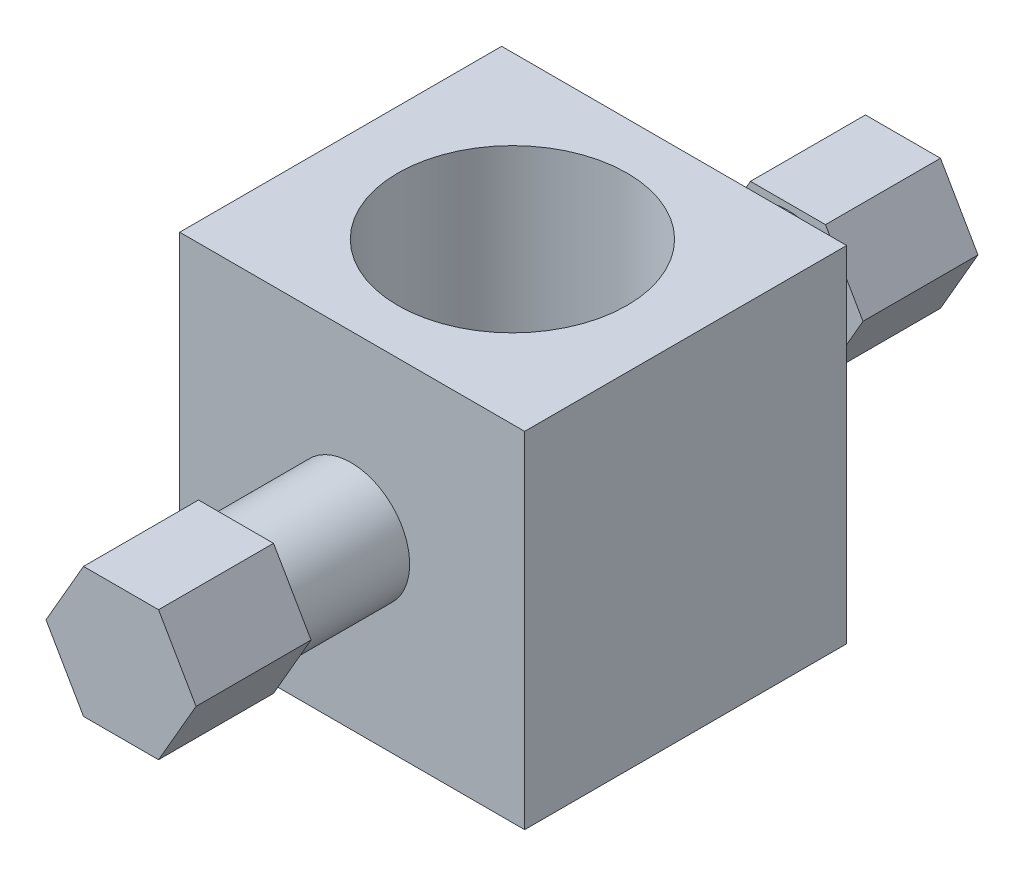
ISO-10303-21;
HEADER;
FILE_DESCRIPTION(('STEP AP214'),'2;1');
FILE_NAME('part.step','',(''),(''),'','','');
FILE_SCHEMA(('AUTOMOTIVE_DESIGN { 1 0 10303 214 1 1 1 1 }'));
ENDSEC;
DATA;
#1=APPLICATION_CONTEXT('core data for automotive mechanical design processes');
#2=APPLICATION_PROTOCOL_DEFINITION('international standard','automotive_design',2000,#1);
#3=PRODUCT_CONTEXT('',#1,'mechanical');
#4=PRODUCT('Part','Part','',(#3));
#5=PRODUCT_RELATED_PRODUCT_CATEGORY('part','',(#4));
#6=PRODUCT_DEFINITION_FORMATION('','',#4);
#7=PRODUCT_DEFINITION_CONTEXT('part definition',#1,'design');
#8=PRODUCT_DEFINITION('design','',#6,#7);
#9=PRODUCT_DEFINITION_SHAPE('','',#8);
#10=(LENGTH_UNIT() NAMED_UNIT(*) SI_UNIT(.MILLI.,.METRE.));
#11=(NAMED_UNIT(*) PLANE_ANGLE_UNIT() SI_UNIT($,.RADIAN.));
#12=(NAMED_UNIT(*) SI_UNIT($,.STERADIAN.) SOLID_ANGLE_UNIT());
#13=UNCERTAINTY_MEASURE_WITH_UNIT(LENGTH_MEASURE(1.E-05),#10,'distance_accuracy_value','');
#14=(GEOMETRIC_REPRESENTATION_CONTEXT(3) GLOBAL_UNCERTAINTY_ASSIGNED_CONTEXT((#13)) GLOBAL_UNIT_ASSIGNED_CONTEXT((#10,
#11,#12)) REPRESENTATION_CONTEXT('',''));
#15=CARTESIAN_POINT('',(0.,0.,0.));
#16=DIRECTION('',(0.,0.,1.));
#17=DIRECTION('',(1.,0.,0.));
#18=AXIS2_PLACEMENT_3D('',#15,#16,#17);
#19=CARTESIAN_POINT('',(0.,0.,24.));
#20=DIRECTION('',(0.,0.,-1.));
#21=DIRECTION('',(-1.,0.,0.));
#22=AXIS2_PLACEMENT_3D('',#19,#20,#21);
#23=CYLINDRICAL_SURFACE('',#22,2.55);
#24=CARTESIAN_POINT('',(0.,0.,24.));
#25=DIRECTION('',(0.,0.,1.));
#26=DIRECTION('',(1.,0.,0.));
#27=AXIS2_PLACEMENT_3D('',#24,#25,#26);
#28=CIRCLE('',#27,2.55);
#29=CARTESIAN_POINT('',(2.55,0.,24.));
#30=VERTEX_POINT('',#29);
#31=EDGE_CURVE('E165',#30,#30,#28,.T.);
#32=ORIENTED_EDGE('',*,*,#31,.F.);
#33=EDGE_LOOP('',(#32));
#34=FACE_BOUND('',#33,.T.);
#35=CARTESIAN_POINT('',(0.,0.,19.));
#36=DIRECTION('',(0.,0.,-1.));
#37=DIRECTION('',(-1.,0.,0.));
#38=AXIS2_PLACEMENT_3D('',#35,#36,#37);
#39=CIRCLE('',#38,2.55);
#40=CARTESIAN_POINT('',(-2.55,0.,19.));
#41=VERTEX_POINT('',#40);
#42=EDGE_CURVE('E11',#41,#41,#39,.T.);
#43=ORIENTED_EDGE('',*,*,#42,.F.);
#44=EDGE_LOOP('',(#43));
#45=FACE_BOUND('',#44,.T.);
#46=ADVANCED_FACE('F39',(#34,#45),#23,.T.);
#47=CARTESIAN_POINT('',(1.6310942277798,-2.82513807444687,29.));
#48=DIRECTION('',(-0.866025403784442,0.499999999999995,0.));
#49=DIRECTION('',(-0.499999999999995,-0.866025403784442,0.));
#50=AXIS2_PLACEMENT_3D('',#47,#48,#49);
#51=PLANE('',#50);
#52=DIRECTION('',(0.499999999999995,0.866025403784442,0.));
#53=VECTOR('',#52,1.);
#54=CARTESIAN_POINT('',(1.6310942277798,-2.82513807444687,24.));
#55=LINE('',#54,#53);
#56=CARTESIAN_POINT('',(1.6310942277798,-2.82513807444687,24.));
#57=VERTEX_POINT('',#56);
#58=CARTESIAN_POINT('',(3.26218845555954,0.,24.));
#59=VERTEX_POINT('',#58);
#60=EDGE_CURVE('E134',#57,#59,#55,.T.);
#61=ORIENTED_EDGE('',*,*,#60,.T.);
#62=DIRECTION('',(0.,0.,-1.));
#63=VECTOR('',#62,1.);
#64=CARTESIAN_POINT('',(3.26218845555954,0.,29.));
#65=LINE('',#64,#63);
#66=CARTESIAN_POINT('',(3.26218845555954,0.,29.));
#67=VERTEX_POINT('',#66);
#68=EDGE_CURVE('E162',#67,#59,#65,.T.);
#69=ORIENTED_EDGE('',*,*,#68,.F.);
#70=DIRECTION('',(0.499999999999995,0.866025403784442,0.));
#71=VECTOR('',#70,1.);
#72=CARTESIAN_POINT('',(1.6310942277798,-2.82513807444687,29.));
#73=LINE('',#72,#71);
#74=CARTESIAN_POINT('',(1.6310942277798,-2.82513807444687,29.));
#75=VERTEX_POINT('',#74);
#76=EDGE_CURVE('E151',#75,#67,#73,.T.);
#77=ORIENTED_EDGE('',*,*,#76,.F.);
#78=DIRECTION('',(0.,0.,-1.));
#79=VECTOR('',#78,1.);
#80=CARTESIAN_POINT('',(1.6310942277798,-2.82513807444687,29.));
#81=LINE('',#80,#79);
#82=EDGE_CURVE('E130',#75,#57,#81,.T.);
#83=ORIENTED_EDGE('',*,*,#82,.T.);
#84=EDGE_LOOP('',(#61,#69,#77,#83));
#85=FACE_BOUND('',#84,.T.);
#86=ADVANCED_FACE('F195',(#85),#51,.F.);
#87=CARTESIAN_POINT('',(3.26218845555954,0.,29.));
#88=DIRECTION('',(-0.866025403784438,-0.500000000000001,0.));
#89=DIRECTION('',(0.500000000000001,-0.866025403784438,0.));
#90=AXIS2_PLACEMENT_3D('',#87,#88,#89);
#91=PLANE('',#90);
#92=DIRECTION('',(-0.500000000000001,0.866025403784438,0.));
#93=VECTOR('',#92,1.);
#94=CARTESIAN_POINT('',(3.26218845555954,0.,24.));
#95=LINE('',#94,#93);
#96=CARTESIAN_POINT('',(1.63109422777977,2.82513807444689,24.));
#97=VERTEX_POINT('',#96);
#98=EDGE_CURVE('E138',#59,#97,#95,.T.);
#99=ORIENTED_EDGE('',*,*,#98,.T.);
#100=DIRECTION('',(0.,0.,-1.));
#101=VECTOR('',#100,1.);
#102=CARTESIAN_POINT('',(1.63109422777977,2.82513807444689,29.));
#103=LINE('',#102,#101);
#104=CARTESIAN_POINT('',(1.63109422777977,2.82513807444689,29.));
#105=VERTEX_POINT('',#104);
#106=EDGE_CURVE('E158',#105,#97,#103,.T.);
#107=ORIENTED_EDGE('',*,*,#106,.F.);
#108=DIRECTION('',(-0.500000000000001,0.866025403784438,0.));
#109=VECTOR('',#108,1.);
#110=CARTESIAN_POINT('',(3.26218845555954,0.,29.));
#111=LINE('',#110,#109);
#112=EDGE_CURVE('E96',#67,#105,#111,.T.);
#113=ORIENTED_EDGE('',*,*,#112,.F.);
#114=ORIENTED_EDGE('',*,*,#68,.T.);
#115=EDGE_LOOP('',(#99,#107,#113,#114));
#116=FACE_BOUND('',#115,.T.);
#117=ADVANCED_FACE('F200',(#116),#91,.F.);
#118=CARTESIAN_POINT('',(1.63109422777977,2.82513807444689,29.));
#119=DIRECTION('',(0.,-1.,0.));
#120=DIRECTION('',(1.,0.,0.));
#121=AXIS2_PLACEMENT_3D('',#118,#119,#120);
#122=PLANE('',#121);
#123=DIRECTION('',(-1.,0.,0.));
#124=VECTOR('',#123,1.);
#125=CARTESIAN_POINT('',(1.63109422777977,2.82513807444689,24.));
#126=LINE('',#125,#124);
#127=CARTESIAN_POINT('',(-1.63109422777978,2.82513807444688,24.));
#128=VERTEX_POINT('',#127);
#129=EDGE_CURVE('E142',#97,#128,#126,.T.);
#130=ORIENTED_EDGE('',*,*,#129,.T.);
#131=DIRECTION('',(0.,0.,-1.));
#132=VECTOR('',#131,1.);
#133=CARTESIAN_POINT('',(-1.63109422777978,2.82513807444688,29.));
#134=LINE('',#133,#132);
#135=CARTESIAN_POINT('',(-1.63109422777978,2.82513807444688,29.));
#136=VERTEX_POINT('',#135);
#137=EDGE_CURVE('E123',#136,#128,#134,.T.);
#138=ORIENTED_EDGE('',*,*,#137,.F.);
#139=DIRECTION('',(-1.,0.,0.));
#140=VECTOR('',#139,1.);
#141=CARTESIAN_POINT('',(1.63109422777977,2.82513807444689,29.));
#142=LINE('',#141,#140);
#143=EDGE_CURVE('E112',#105,#136,#142,.T.);
#144=ORIENTED_EDGE('',*,*,#143,.F.);
#145=ORIENTED_EDGE('',*,*,#106,.T.);
#146=EDGE_LOOP('',(#130,#138,#144,#145));
#147=FACE_BOUND('',#146,.T.);
#148=ADVANCED_FACE('F361',(#147),#122,.F.);
#149=CARTESIAN_POINT('',(-1.63109422777978,2.82513807444688,29.));
#150=DIRECTION('',(0.866025403784442,-0.499999999999995,0.));
#151=DIRECTION('',(0.499999999999995,0.866025403784442,0.));
#152=AXIS2_PLACEMENT_3D('',#149,#150,#151);
#153=PLANE('',#152);
#154=DIRECTION('',(-0.499999999999995,-0.866025403784442,0.));
#155=VECTOR('',#154,1.);
#156=CARTESIAN_POINT('',(-1.63109422777978,2.82513807444688,24.));
#157=LINE('',#156,#155);
#158=CARTESIAN_POINT('',(-3.26218845555954,0.,24.));
#159=VERTEX_POINT('',#158);
#160=EDGE_CURVE('E121',#128,#159,#157,.T.);
#161=ORIENTED_EDGE('',*,*,#160,.T.);
#162=DIRECTION('',(0.,0.,-1.));
#163=VECTOR('',#162,1.);
#164=CARTESIAN_POINT('',(-3.26218845555954,0.,29.));
#165=LINE('',#164,#163);
#166=CARTESIAN_POINT('',(-3.26218845555954,0.,29.));
#167=VERTEX_POINT('',#166);
#168=EDGE_CURVE('E118',#167,#159,#165,.T.);
#169=ORIENTED_EDGE('',*,*,#168,.F.);
#170=DIRECTION('',(-0.499999999999995,-0.866025403784442,0.));
#171=VECTOR('',#170,1.);
#172=CARTESIAN_POINT('',(-1.63109422777978,2.82513807444688,29.));
#173=LINE('',#172,#171);
#174=EDGE_CURVE('E106',#136,#167,#173,.T.);
#175=ORIENTED_EDGE('',*,*,#174,.F.);
#176=ORIENTED_EDGE('',*,*,#137,.T.);
#177=EDGE_LOOP('',(#161,#169,#175,#176));
#178=FACE_BOUND('',#177,.T.);
#179=ADVANCED_FACE('F119',(#178),#153,.F.);
#180=CARTESIAN_POINT('',(-3.26218845555954,0.,29.));
#181=DIRECTION('',(0.866025403784435,0.500000000000007,0.));
#182=DIRECTION('',(-0.500000000000007,0.866025403784435,0.));
#183=AXIS2_PLACEMENT_3D('',#180,#181,#182);
#184=PLANE('',#183);
#185=DIRECTION('',(0.500000000000007,-0.866025403784435,0.));
#186=VECTOR('',#185,1.);
#187=CARTESIAN_POINT('',(-3.26218845555954,0.,24.));
#188=LINE('',#187,#186);
#189=CARTESIAN_POINT('',(-1.63109422777975,-2.8251380744469,24.));
#190=VERTEX_POINT('',#189);
#191=EDGE_CURVE('E81',#159,#190,#188,.T.);
#192=ORIENTED_EDGE('',*,*,#191,.T.);
#193=DIRECTION('',(0.,0.,-1.));
#194=VECTOR('',#193,1.);
#195=CARTESIAN_POINT('',(-1.63109422777975,-2.8251380744469,29.));
#196=LINE('',#195,#194);
#197=CARTESIAN_POINT('',(-1.63109422777975,-2.8251380744469,29.));
#198=VERTEX_POINT('',#197);
#199=EDGE_CURVE('E124',#198,#190,#196,.T.);
#200=ORIENTED_EDGE('',*,*,#199,.F.);
#201=DIRECTION('',(0.500000000000007,-0.866025403784435,0.));
#202=VECTOR('',#201,1.);
#203=CARTESIAN_POINT('',(-3.26218845555954,0.,29.));
#204=LINE('',#203,#202);
#205=EDGE_CURVE('E110',#167,#198,#204,.T.);
#206=ORIENTED_EDGE('',*,*,#205,.F.);
#207=ORIENTED_EDGE('',*,*,#168,.T.);
#208=EDGE_LOOP('',(#192,#200,#206,#207));
#209=FACE_BOUND('',#208,.T.);
#210=ADVANCED_FACE('F126',(#209),#184,.F.);
#211=CARTESIAN_POINT('',(-1.63109422777975,-2.8251380744469,29.));
#212=DIRECTION('',(0.,1.,0.));
#213=DIRECTION('',(-1.,0.,0.));
#214=AXIS2_PLACEMENT_3D('',#211,#212,#213);
#215=PLANE('',#214);
#216=DIRECTION('',(1.,0.,0.));
#217=VECTOR('',#216,1.);
#218=CARTESIAN_POINT('',(-1.63109422777975,-2.8251380744469,24.));
#219=LINE('',#218,#217);
#220=EDGE_CURVE('E87',#190,#57,#219,.T.);
#221=ORIENTED_EDGE('',*,*,#220,.T.);
#222=ORIENTED_EDGE('',*,*,#82,.F.);
#223=DIRECTION('',(1.,0.,0.));
#224=VECTOR('',#223,1.);
#225=CARTESIAN_POINT('',(-1.63109422777975,-2.8251380744469,29.));
#226=LINE('',#225,#224);
#227=EDGE_CURVE('E57',#198,#75,#226,.T.);
#228=ORIENTED_EDGE('',*,*,#227,.F.);
#229=ORIENTED_EDGE('',*,*,#199,.T.);
#230=EDGE_LOOP('',(#221,#222,#228,#229));
#231=FACE_BOUND('',#230,.T.);
#232=ADVANCED_FACE('F365',(#231),#215,.F.);
#233=CARTESIAN_POINT('',(0.,0.,29.));
#234=DIRECTION('',(0.,0.,1.));
#235=DIRECTION('',(1.,0.,0.));
#236=AXIS2_PLACEMENT_3D('',#233,#234,#235);
#237=PLANE('',#236);
#238=ORIENTED_EDGE('',*,*,#76,.T.);
#239=ORIENTED_EDGE('',*,*,#112,.T.);
#240=ORIENTED_EDGE('',*,*,#143,.T.);
#241=ORIENTED_EDGE('',*,*,#174,.T.);
#242=ORIENTED_EDGE('',*,*,#205,.T.);
#243=ORIENTED_EDGE('',*,*,#227,.T.);
#244=EDGE_LOOP('',(#238,#239,#240,#241,#242,#243));
#245=FACE_BOUND('',#244,.T.);
#246=ADVANCED_FACE('F108',(#245),#237,.T.);
#247=CARTESIAN_POINT('',(0.,0.,24.));
#248=DIRECTION('',(0.,0.,1.));
#249=DIRECTION('',(1.,0.,0.));
#250=AXIS2_PLACEMENT_3D('',#247,#248,#249);
#251=PLANE('',#250);
#252=ORIENTED_EDGE('',*,*,#31,.T.);
#253=EDGE_LOOP('',(#252));
#254=FACE_BOUND('',#253,.T.);
#255=ORIENTED_EDGE('',*,*,#60,.F.);
#256=ORIENTED_EDGE('',*,*,#220,.F.);
#257=ORIENTED_EDGE('',*,*,#191,.F.);
#258=ORIENTED_EDGE('',*,*,#160,.F.);
#259=ORIENTED_EDGE('',*,*,#129,.F.);
#260=ORIENTED_EDGE('',*,*,#98,.F.);
#261=EDGE_LOOP('',(#255,#256,#257,#258,#259,#260));
#262=FACE_BOUND('',#261,.T.);
#263=ADVANCED_FACE('F364',(#254,#262),#251,.F.);
#264=CARTESIAN_POINT('',(-7.45,7.5,5.));
#265=DIRECTION('',(1.,0.,0.));
#266=DIRECTION('',(0.,0.,-1.));
#267=AXIS2_PLACEMENT_3D('',#264,#265,#266);
#268=PLANE('',#267);
#269=DIRECTION('',(0.,-1.,0.));
#270=VECTOR('',#269,1.);
#271=CARTESIAN_POINT('',(-7.45,7.5,5.));
#272=LINE('',#271,#270);
#273=CARTESIAN_POINT('',(-7.45,7.5,5.));
#274=VERTEX_POINT('',#273);
#275=CARTESIAN_POINT('',(-7.45,-7.5,5.));
#276=VERTEX_POINT('',#275);
#277=EDGE_CURVE('E248',#274,#276,#272,.T.);
#278=ORIENTED_EDGE('',*,*,#277,.T.);
#279=DIRECTION('',(0.,0.,1.));
#280=VECTOR('',#279,1.);
#281=CARTESIAN_POINT('',(-7.45,-7.5,5.));
#282=LINE('',#281,#280);
#283=CARTESIAN_POINT('',(-7.45,-7.5,19.));
#284=VERTEX_POINT('',#283);
#285=EDGE_CURVE('E240',#276,#284,#282,.T.);
#286=ORIENTED_EDGE('',*,*,#285,.T.);
#287=DIRECTION('',(0.,-1.,0.));
#288=VECTOR('',#287,1.);
#289=CARTESIAN_POINT('',(-7.45,7.5,19.));
#290=LINE('',#289,#288);
#291=CARTESIAN_POINT('',(-7.45,7.5,19.));
#292=VERTEX_POINT('',#291);
#293=EDGE_CURVE('E217',#292,#284,#290,.T.);
#294=ORIENTED_EDGE('',*,*,#293,.F.);
#295=DIRECTION('',(0.,0.,1.));
#296=VECTOR('',#295,1.);
#297=CARTESIAN_POINT('',(-7.45,7.5,5.));
#298=LINE('',#297,#296);
#299=EDGE_CURVE('E261',#274,#292,#298,.T.);
#300=ORIENTED_EDGE('',*,*,#299,.F.);
#301=EDGE_LOOP('',(#278,#286,#294,#300));
#302=FACE_BOUND('',#301,.T.);
#303=ADVANCED_FACE('F210',(#302),#268,.F.);
#304=CARTESIAN_POINT('',(-7.45,7.5,19.));
#305=DIRECTION('',(0.,0.,-1.));
#306=DIRECTION('',(-1.,0.,0.));
#307=AXIS2_PLACEMENT_3D('',#304,#305,#306);
#308=PLANE('',#307);
#309=ORIENTED_EDGE('',*,*,#42,.T.);
#310=EDGE_LOOP('',(#309));
#311=FACE_BOUND('',#310,.T.);
#312=ORIENTED_EDGE('',*,*,#293,.T.);
#313=DIRECTION('',(1.,0.,0.));
#314=VECTOR('',#313,1.);
#315=CARTESIAN_POINT('',(-7.45,-7.5,19.));
#316=LINE('',#315,#314);
#317=CARTESIAN_POINT('',(7.55,-7.5,19.));
#318=VERTEX_POINT('',#317);
#319=EDGE_CURVE('E221',#284,#318,#316,.T.);
#320=ORIENTED_EDGE('',*,*,#319,.T.);
#321=DIRECTION('',(0.,-1.,0.));
#322=VECTOR('',#321,1.);
#323=CARTESIAN_POINT('',(7.55,7.5,19.));
#324=LINE('',#323,#322);
#325=CARTESIAN_POINT('',(7.55,7.5,19.));
#326=VERTEX_POINT('',#325);
#327=EDGE_CURVE('E232',#326,#318,#324,.T.);
#328=ORIENTED_EDGE('',*,*,#327,.F.);
#329=DIRECTION('',(1.,0.,0.));
#330=VECTOR('',#329,1.);
#331=CARTESIAN_POINT('',(-7.45,7.5,19.));
#332=LINE('',#331,#330);
#333=EDGE_CURVE('E224',#292,#326,#332,.T.);
#334=ORIENTED_EDGE('',*,*,#333,.F.);
#335=EDGE_LOOP('',(#312,#320,#328,#334));
#336=FACE_BOUND('',#335,.T.);
#337=ADVANCED_FACE('F206',(#311,#336),#308,.F.);
#338=CARTESIAN_POINT('',(7.55,7.5,5.));
#339=DIRECTION('',(-1.,0.,0.));
#340=DIRECTION('',(0.,0.,1.));
#341=AXIS2_PLACEMENT_3D('',#338,#339,#340);
#342=PLANE('',#341);
#343=ORIENTED_EDGE('',*,*,#327,.T.);
#344=DIRECTION('',(0.,0.,-1.));
#345=VECTOR('',#344,1.);
#346=CARTESIAN_POINT('',(7.55,-7.5,5.));
#347=LINE('',#346,#345);
#348=CARTESIAN_POINT('',(7.55,-7.5,5.));
#349=VERTEX_POINT('',#348);
#350=EDGE_CURVE('E243',#318,#349,#347,.T.);
#351=ORIENTED_EDGE('',*,*,#350,.T.);
#352=DIRECTION('',(0.,-1.,0.));
#353=VECTOR('',#352,1.);
#354=CARTESIAN_POINT('',(7.55,7.5,5.));
#355=LINE('',#354,#353);
#356=CARTESIAN_POINT('',(7.55,7.5,5.));
#357=VERTEX_POINT('',#356);
#358=EDGE_CURVE('E276',#357,#349,#355,.T.);
#359=ORIENTED_EDGE('',*,*,#358,.F.);
#360=DIRECTION('',(0.,0.,-1.));
#361=VECTOR('',#360,1.);
#362=CARTESIAN_POINT('',(7.55,7.5,5.));
#363=LINE('',#362,#361);
#364=EDGE_CURVE('E266',#326,#357,#363,.T.);
#365=ORIENTED_EDGE('',*,*,#364,.F.);
#366=EDGE_LOOP('',(#343,#351,#359,#365));
#367=FACE_BOUND('',#366,.T.);
#368=ADVANCED_FACE('F209',(#367),#342,.F.);
#369=CARTESIAN_POINT('',(-7.45,7.5,5.));
#370=DIRECTION('',(0.,0.,1.));
#371=DIRECTION('',(1.,0.,0.));
#372=AXIS2_PLACEMENT_3D('',#369,#370,#371);
#373=PLANE('',#372);
#374=CARTESIAN_POINT('',(0.,0.,5.));
#375=DIRECTION('',(0.,0.,1.));
#376=DIRECTION('',(1.,0.,0.));
#377=AXIS2_PLACEMENT_3D('',#374,#375,#376);
#378=CIRCLE('',#377,2.55);
#379=CARTESIAN_POINT('',(2.55,0.,5.));
#380=VERTEX_POINT('',#379);
#381=EDGE_CURVE('E49',#380,#380,#378,.T.);
#382=ORIENTED_EDGE('',*,*,#381,.T.);
#383=EDGE_LOOP('',(#382));
#384=FACE_BOUND('',#383,.T.);
#385=ORIENTED_EDGE('',*,*,#358,.T.);
#386=DIRECTION('',(-1.,0.,0.));
#387=VECTOR('',#386,1.);
#388=CARTESIAN_POINT('',(-7.45,-7.5,5.));
#389=LINE('',#388,#387);
#390=EDGE_CURVE('E258',#349,#276,#389,.T.);
#391=ORIENTED_EDGE('',*,*,#390,.T.);
#392=ORIENTED_EDGE('',*,*,#277,.F.);
#393=DIRECTION('',(-1.,0.,0.));
#394=VECTOR('',#393,1.);
#395=CARTESIAN_POINT('',(-7.45,7.5,5.));
#396=LINE('',#395,#394);
#397=EDGE_CURVE('E270',#357,#274,#396,.T.);
#398=ORIENTED_EDGE('',*,*,#397,.F.);
#399=EDGE_LOOP('',(#385,#391,#392,#398));
#400=FACE_BOUND('',#399,.T.);
#401=ADVANCED_FACE('F177',(#384,#400),#373,.F.);
#402=CARTESIAN_POINT('',(0.,7.5,0.));
#403=DIRECTION('',(0.,1.,0.));
#404=DIRECTION('',(0.,0.,1.));
#405=AXIS2_PLACEMENT_3D('',#402,#403,#404);
#406=PLANE('',#405);
#407=CARTESIAN_POINT('',(0.0500000000000014,7.5,12.0313872590249));
#408=DIRECTION('',(0.,1.,0.));
#409=DIRECTION('',(0.,0.,1.));
#410=AXIS2_PLACEMENT_3D('',#407,#408,#409);
#411=CIRCLE('',#410,4.98637357828962);
#412=CARTESIAN_POINT('',(0.0500000000000014,7.5,17.0177608373145));
#413=VERTEX_POINT('',#412);
#414=EDGE_CURVE('E253',#413,#413,#411,.T.);
#415=ORIENTED_EDGE('',*,*,#414,.F.);
#416=EDGE_LOOP('',(#415));
#417=FACE_BOUND('',#416,.T.);
#418=ORIENTED_EDGE('',*,*,#299,.T.);
#419=ORIENTED_EDGE('',*,*,#333,.T.);
#420=ORIENTED_EDGE('',*,*,#364,.T.);
#421=ORIENTED_EDGE('',*,*,#397,.T.);
#422=EDGE_LOOP('',(#418,#419,#420,#421));
#423=FACE_BOUND('',#422,.T.);
#424=ADVANCED_FACE('F527',(#417,#423),#406,.T.);
#425=CARTESIAN_POINT('',(0.,-7.5,0.));
#426=DIRECTION('',(0.,1.,0.));
#427=DIRECTION('',(0.,0.,1.));
#428=AXIS2_PLACEMENT_3D('',#425,#426,#427);
#429=PLANE('',#428);
#430=CARTESIAN_POINT('',(0.0500000000000014,-7.5,12.0313872590249));
#431=DIRECTION('',(0.,1.,0.));
#432=DIRECTION('',(0.,0.,1.));
#433=AXIS2_PLACEMENT_3D('',#430,#431,#432);
#434=CIRCLE('',#433,4.98637357828962);
#435=CARTESIAN_POINT('',(0.0500000000000014,-7.5,17.0177608373145));
#436=VERTEX_POINT('',#435);
#437=EDGE_CURVE('E42',#436,#436,#434,.T.);
#438=ORIENTED_EDGE('',*,*,#437,.T.);
#439=EDGE_LOOP('',(#438));
#440=FACE_BOUND('',#439,.T.);
#441=ORIENTED_EDGE('',*,*,#285,.F.);
#442=ORIENTED_EDGE('',*,*,#390,.F.);
#443=ORIENTED_EDGE('',*,*,#350,.F.);
#444=ORIENTED_EDGE('',*,*,#319,.F.);
#445=EDGE_LOOP('',(#441,#442,#443,#444));
#446=FACE_BOUND('',#445,.T.);
#447=ADVANCED_FACE('F237',(#440,#446),#429,.F.);
#448=CARTESIAN_POINT('',(0.,0.,-5.));
#449=DIRECTION('',(0.,0.,-1.));
#450=DIRECTION('',(-1.,0.,0.));
#451=AXIS2_PLACEMENT_3D('',#448,#449,#450);
#452=PLANE('',#451);
#453=DIRECTION('',(-0.500000000000001,0.866025403784438,0.));
#454=VECTOR('',#453,1.);
#455=CARTESIAN_POINT('',(-1.63109422777978,-2.82513807444688,-5.));
#456=LINE('',#455,#454);
#457=CARTESIAN_POINT('',(-1.63109422777978,-2.82513807444688,-5.));
#458=VERTEX_POINT('',#457);
#459=CARTESIAN_POINT('',(-3.26218845555954,0.,-5.));
#460=VERTEX_POINT('',#459);
#461=EDGE_CURVE('E283',#458,#460,#456,.T.);
#462=ORIENTED_EDGE('',*,*,#461,.T.);
#463=DIRECTION('',(0.499999999999995,0.866025403784442,0.));
#464=VECTOR('',#463,1.);
#465=CARTESIAN_POINT('',(-3.26218845555954,0.,-5.));
#466=LINE('',#465,#464);
#467=CARTESIAN_POINT('',(-1.63109422777978,2.82513807444688,-5.));
#468=VERTEX_POINT('',#467);
#469=EDGE_CURVE('E287',#460,#468,#466,.T.);
#470=ORIENTED_EDGE('',*,*,#469,.T.);
#471=DIRECTION('',(1.,0.,0.));
#472=VECTOR('',#471,1.);
#473=CARTESIAN_POINT('',(-1.63109422777978,2.82513807444688,-5.));
#474=LINE('',#473,#472);
#475=CARTESIAN_POINT('',(1.63109422777976,2.82513807444689,-5.));
#476=VERTEX_POINT('',#475);
#477=EDGE_CURVE('E292',#468,#476,#474,.T.);
#478=ORIENTED_EDGE('',*,*,#477,.T.);
#479=DIRECTION('',(0.500000000000001,-0.866025403784438,0.));
#480=VECTOR('',#479,1.);
#481=CARTESIAN_POINT('',(1.63109422777976,2.82513807444689,-5.));
#482=LINE('',#481,#480);
#483=CARTESIAN_POINT('',(3.26218845555954,0.,-5.));
#484=VERTEX_POINT('',#483);
#485=EDGE_CURVE('E296',#476,#484,#482,.T.);
#486=ORIENTED_EDGE('',*,*,#485,.T.);
#487=DIRECTION('',(-0.500000000000001,-0.866025403784438,0.));
#488=VECTOR('',#487,1.);
#489=CARTESIAN_POINT('',(3.26218845555954,0.,-5.));
#490=LINE('',#489,#488);
#491=CARTESIAN_POINT('',(1.63109422777976,-2.82513807444689,-5.));
#492=VERTEX_POINT('',#491);
#493=EDGE_CURVE('E300',#484,#492,#490,.T.);
#494=ORIENTED_EDGE('',*,*,#493,.T.);
#495=DIRECTION('',(-1.,0.,0.));
#496=VECTOR('',#495,1.);
#497=CARTESIAN_POINT('',(1.63109422777976,-2.82513807444689,-5.));
#498=LINE('',#497,#496);
#499=EDGE_CURVE('E304',#492,#458,#498,.T.);
#500=ORIENTED_EDGE('',*,*,#499,.T.);
#501=EDGE_LOOP('',(#462,#470,#478,#486,#494,#500));
#502=FACE_BOUND('',#501,.T.);
#503=ADVANCED_FACE('F438',(#502),#452,.T.);
#504=CARTESIAN_POINT('',(-3.26218845555954,0.,-5.));
#505=DIRECTION('',(0.866025403784442,-0.499999999999995,0.));
#506=DIRECTION('',(0.499999999999995,0.866025403784442,0.));
#507=AXIS2_PLACEMENT_3D('',#504,#505,#506);
#508=PLANE('',#507);
#509=DIRECTION('',(0.499999999999995,0.866025403784442,0.));
#510=VECTOR('',#509,1.);
#511=CARTESIAN_POINT('',(-3.26218845555954,0.,0.));
#512=LINE('',#511,#510);
#513=CARTESIAN_POINT('',(-3.26218845555954,0.,0.));
#514=VERTEX_POINT('',#513);
#515=CARTESIAN_POINT('',(-1.63109422777978,2.82513807444688,0.));
#516=VERTEX_POINT('',#515);
#517=EDGE_CURVE('E312',#514,#516,#512,.T.);
#518=ORIENTED_EDGE('',*,*,#517,.T.);
#519=DIRECTION('',(0.,0.,1.));
#520=VECTOR('',#519,1.);
#521=CARTESIAN_POINT('',(-1.63109422777978,2.82513807444688,-5.));
#522=LINE('',#521,#520);
#523=EDGE_CURVE('E346',#468,#516,#522,.T.);
#524=ORIENTED_EDGE('',*,*,#523,.F.);
#525=ORIENTED_EDGE('',*,*,#469,.F.);
#526=DIRECTION('',(0.,0.,1.));
#527=VECTOR('',#526,1.);
#528=CARTESIAN_POINT('',(-3.26218845555954,0.,-5.));
#529=LINE('',#528,#527);
#530=EDGE_CURVE('E172',#460,#514,#529,.T.);
#531=ORIENTED_EDGE('',*,*,#530,.T.);
#532=EDGE_LOOP('',(#518,#524,#525,#531));
#533=FACE_BOUND('',#532,.T.);
#534=ADVANCED_FACE('F433',(#533),#508,.F.);
#535=CARTESIAN_POINT('',(-1.63109422777978,2.82513807444688,-5.));
#536=DIRECTION('',(0.,-1.,0.));
#537=DIRECTION('',(1.,0.,0.));
#538=AXIS2_PLACEMENT_3D('',#535,#536,#537);
#539=PLANE('',#538);
#540=DIRECTION('',(1.,0.,0.));
#541=VECTOR('',#540,1.);
#542=CARTESIAN_POINT('',(-1.63109422777978,2.82513807444688,0.));
#543=LINE('',#542,#541);
#544=CARTESIAN_POINT('',(1.63109422777976,2.82513807444689,0.));
#545=VERTEX_POINT('',#544);
#546=EDGE_CURVE('E316',#516,#545,#543,.T.);
#547=ORIENTED_EDGE('',*,*,#546,.T.);
#548=DIRECTION('',(0.,0.,1.));
#549=VECTOR('',#548,1.);
#550=CARTESIAN_POINT('',(1.63109422777976,2.82513807444689,-5.));
#551=LINE('',#550,#549);
#552=EDGE_CURVE('E342',#476,#545,#551,.T.);
#553=ORIENTED_EDGE('',*,*,#552,.F.);
#554=ORIENTED_EDGE('',*,*,#477,.F.);
#555=ORIENTED_EDGE('',*,*,#523,.T.);
#556=EDGE_LOOP('',(#547,#553,#554,#555));
#557=FACE_BOUND('',#556,.T.);
#558=ADVANCED_FACE('F437',(#557),#539,.F.);
#559=CARTESIAN_POINT('',(1.63109422777976,2.82513807444689,-5.));
#560=DIRECTION('',(-0.866025403784438,-0.500000000000001,0.));
#561=DIRECTION('',(0.500000000000001,-0.866025403784438,0.));
#562=AXIS2_PLACEMENT_3D('',#559,#560,#561);
#563=PLANE('',#562);
#564=DIRECTION('',(0.500000000000001,-0.866025403784438,0.));
#565=VECTOR('',#564,1.);
#566=CARTESIAN_POINT('',(1.63109422777976,2.82513807444689,0.));
#567=LINE('',#566,#565);
#568=CARTESIAN_POINT('',(3.26218845555954,0.,0.));
#569=VERTEX_POINT('',#568);
#570=EDGE_CURVE('E320',#545,#569,#567,.T.);
#571=ORIENTED_EDGE('',*,*,#570,.T.);
#572=DIRECTION('',(0.,0.,1.));
#573=VECTOR('',#572,1.);
#574=CARTESIAN_POINT('',(3.26218845555954,0.,-5.));
#575=LINE('',#574,#573);
#576=EDGE_CURVE('E338',#484,#569,#575,.T.);
#577=ORIENTED_EDGE('',*,*,#576,.F.);
#578=ORIENTED_EDGE('',*,*,#485,.F.);
#579=ORIENTED_EDGE('',*,*,#552,.T.);
#580=EDGE_LOOP('',(#571,#577,#578,#579));
#581=FACE_BOUND('',#580,.T.);
#582=ADVANCED_FACE('F449',(#581),#563,.F.);
#583=CARTESIAN_POINT('',(3.26218845555954,0.,-5.));
#584=DIRECTION('',(-0.866025403784438,0.500000000000001,0.));
#585=DIRECTION('',(-0.500000000000001,-0.866025403784438,0.));
#586=AXIS2_PLACEMENT_3D('',#583,#584,#585);
#587=PLANE('',#586);
#588=DIRECTION('',(-0.500000000000001,-0.866025403784438,0.));
#589=VECTOR('',#588,1.);
#590=CARTESIAN_POINT('',(3.26218845555954,0.,0.));
#591=LINE('',#590,#589);
#592=CARTESIAN_POINT('',(1.63109422777976,-2.82513807444689,0.));
#593=VERTEX_POINT('',#592);
#594=EDGE_CURVE('E324',#569,#593,#591,.T.);
#595=ORIENTED_EDGE('',*,*,#594,.T.);
#596=DIRECTION('',(0.,0.,1.));
#597=VECTOR('',#596,1.);
#598=CARTESIAN_POINT('',(1.63109422777976,-2.82513807444689,-5.));
#599=LINE('',#598,#597);
#600=EDGE_CURVE('E334',#492,#593,#599,.T.);
#601=ORIENTED_EDGE('',*,*,#600,.F.);
#602=ORIENTED_EDGE('',*,*,#493,.F.);
#603=ORIENTED_EDGE('',*,*,#576,.T.);
#604=EDGE_LOOP('',(#595,#601,#602,#603));
#605=FACE_BOUND('',#604,.T.);
#606=ADVANCED_FACE('F459',(#605),#587,.F.);
#607=CARTESIAN_POINT('',(1.63109422777976,-2.82513807444689,-5.));
#608=DIRECTION('',(0.,1.,0.));
#609=DIRECTION('',(-1.,0.,0.));
#610=AXIS2_PLACEMENT_3D('',#607,#608,#609);
#611=PLANE('',#610);
#612=DIRECTION('',(-1.,0.,0.));
#613=VECTOR('',#612,1.);
#614=CARTESIAN_POINT('',(1.63109422777976,-2.82513807444689,0.));
#615=LINE('',#614,#613);
#616=CARTESIAN_POINT('',(-1.63109422777978,-2.82513807444688,0.));
#617=VERTEX_POINT('',#616);
#618=EDGE_CURVE('E288',#593,#617,#615,.T.);
#619=ORIENTED_EDGE('',*,*,#618,.T.);
#620=DIRECTION('',(0.,0.,1.));
#621=VECTOR('',#620,1.);
#622=CARTESIAN_POINT('',(-1.63109422777978,-2.82513807444688,-5.));
#623=LINE('',#622,#621);
#624=EDGE_CURVE('E308',#458,#617,#623,.T.);
#625=ORIENTED_EDGE('',*,*,#624,.F.);
#626=ORIENTED_EDGE('',*,*,#499,.F.);
#627=ORIENTED_EDGE('',*,*,#600,.T.);
#628=EDGE_LOOP('',(#619,#625,#626,#627));
#629=FACE_BOUND('',#628,.T.);
#630=ADVANCED_FACE('F425',(#629),#611,.F.);
#631=CARTESIAN_POINT('',(-1.63109422777978,-2.82513807444688,-5.));
#632=DIRECTION('',(0.866025403784438,0.500000000000001,0.));
#633=DIRECTION('',(-0.500000000000001,0.866025403784438,0.));
#634=AXIS2_PLACEMENT_3D('',#631,#632,#633);
#635=PLANE('',#634);
#636=DIRECTION('',(-0.500000000000001,0.866025403784438,0.));
#637=VECTOR('',#636,1.);
#638=CARTESIAN_POINT('',(-1.63109422777978,-2.82513807444688,0.));
#639=LINE('',#638,#637);
#640=EDGE_CURVE('E231',#617,#514,#639,.T.);
#641=ORIENTED_EDGE('',*,*,#640,.T.);
#642=ORIENTED_EDGE('',*,*,#530,.F.);
#643=ORIENTED_EDGE('',*,*,#461,.F.);
#644=ORIENTED_EDGE('',*,*,#624,.T.);
#645=EDGE_LOOP('',(#641,#642,#643,#644));
#646=FACE_BOUND('',#645,.T.);
#647=ADVANCED_FACE('F191',(#646),#635,.F.);
#648=CARTESIAN_POINT('',(0.,0.,0.));
#649=DIRECTION('',(0.,0.,-1.));
#650=DIRECTION('',(-1.,0.,0.));
#651=AXIS2_PLACEMENT_3D('',#648,#649,#650);
#652=PLANE('',#651);
#653=CARTESIAN_POINT('',(0.,0.,0.));
#654=DIRECTION('',(0.,0.,1.));
#655=DIRECTION('',(1.,0.,0.));
#656=AXIS2_PLACEMENT_3D('',#653,#654,#655);
#657=CIRCLE('',#656,2.55);
#658=CARTESIAN_POINT('',(2.55,0.,0.));
#659=VERTEX_POINT('',#658);
#660=EDGE_CURVE('E139',#659,#659,#657,.T.);
#661=ORIENTED_EDGE('',*,*,#660,.F.);
#662=EDGE_LOOP('',(#661));
#663=FACE_BOUND('',#662,.T.);
#664=ORIENTED_EDGE('',*,*,#640,.F.);
#665=ORIENTED_EDGE('',*,*,#618,.F.);
#666=ORIENTED_EDGE('',*,*,#594,.F.);
#667=ORIENTED_EDGE('',*,*,#570,.F.);
#668=ORIENTED_EDGE('',*,*,#546,.F.);
#669=ORIENTED_EDGE('',*,*,#517,.F.);
#670=EDGE_LOOP('',(#664,#665,#666,#667,#668,#669));
#671=FACE_BOUND('',#670,.T.);
#672=ADVANCED_FACE('F183',(#663,#671),#652,.F.);
#673=ORIENTED_EDGE('',*,*,#660,.T.);
#674=EDGE_LOOP('',(#673));
#675=FACE_BOUND('',#674,.T.);
#676=ORIENTED_EDGE('',*,*,#381,.F.);
#677=EDGE_LOOP('',(#676));
#678=FACE_BOUND('',#677,.T.);
#679=ADVANCED_FACE('F180',(#675,#678),#23,.T.);
#680=CARTESIAN_POINT('',(0.0500000000000014,-9.00000000000001,12.0313872590249));
#681=DIRECTION('',(0.,1.,0.));
#682=DIRECTION('',(0.,0.,1.));
#683=AXIS2_PLACEMENT_3D('',#680,#681,#682);
#684=CYLINDRICAL_SURFACE('',#683,4.98637357828962);
#685=ORIENTED_EDGE('',*,*,#414,.T.);
#686=EDGE_LOOP('',(#685));
#687=FACE_BOUND('',#686,.T.);
#688=ORIENTED_EDGE('',*,*,#437,.F.);
#689=EDGE_LOOP('',(#688));
#690=FACE_BOUND('',#689,.T.);
#691=ADVANCED_FACE('F182',(#687,#690),#684,.F.);
#692=CLOSED_SHELL('',(#46,#86,#117,#148,#179,#210,#232,#246,#263,#303,#337,#368,#401,#424,#447,
#503,#534,#558,#582,#606,#630,#647,#672,#679,#691));
#693=MANIFOLD_SOLID_BREP('B2',#692);
#694=ADVANCED_BREP_SHAPE_REPRESENTATION('',(#18,#693),#14);
#695=SHAPE_DEFINITION_REPRESENTATION(#9,#694);
ENDSEC;
END-ISO-10303-21;
